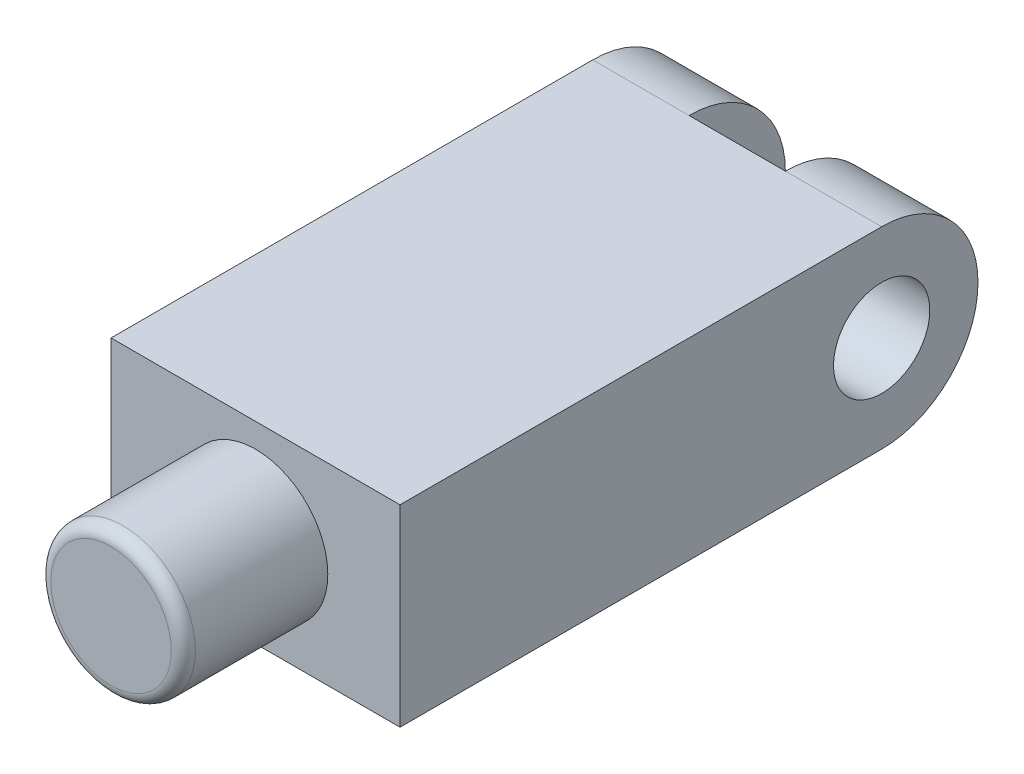
ISO-10303-21;
HEADER;
FILE_DESCRIPTION(('STEP AP214'),'2;1');
FILE_NAME('part.step','',(''),(''),'','','');
FILE_SCHEMA(('AUTOMOTIVE_DESIGN { 1 0 10303 214 1 1 1 1 }'));
ENDSEC;
DATA;
#1=APPLICATION_CONTEXT('core data for automotive mechanical design processes');
#2=APPLICATION_PROTOCOL_DEFINITION('international standard','automotive_design',2000,#1);
#3=PRODUCT_CONTEXT('',#1,'mechanical');
#4=PRODUCT('Part','Part','',(#3));
#5=PRODUCT_RELATED_PRODUCT_CATEGORY('part','',(#4));
#6=PRODUCT_DEFINITION_FORMATION('','',#4);
#7=PRODUCT_DEFINITION_CONTEXT('part definition',#1,'design');
#8=PRODUCT_DEFINITION('design','',#6,#7);
#9=PRODUCT_DEFINITION_SHAPE('','',#8);
#10=(LENGTH_UNIT() NAMED_UNIT(*) SI_UNIT(.MILLI.,.METRE.));
#11=(NAMED_UNIT(*) PLANE_ANGLE_UNIT() SI_UNIT($,.RADIAN.));
#12=(NAMED_UNIT(*) SI_UNIT($,.STERADIAN.) SOLID_ANGLE_UNIT());
#13=UNCERTAINTY_MEASURE_WITH_UNIT(LENGTH_MEASURE(1.E-05),#10,'distance_accuracy_value','');
#14=(GEOMETRIC_REPRESENTATION_CONTEXT(3) GLOBAL_UNCERTAINTY_ASSIGNED_CONTEXT((#13)) GLOBAL_UNIT_ASSIGNED_CONTEXT((#10,
#11,#12)) REPRESENTATION_CONTEXT('',''));
#15=CARTESIAN_POINT('',(0.,0.,0.));
#16=DIRECTION('',(0.,0.,1.));
#17=DIRECTION('',(1.,0.,0.));
#18=AXIS2_PLACEMENT_3D('',#15,#16,#17);
#19=CARTESIAN_POINT('',(50.,5.,0.));
#20=DIRECTION('',(-1.,0.,0.));
#21=DIRECTION('',(0.,0.,1.));
#22=AXIS2_PLACEMENT_3D('',#19,#20,#21);
#23=CYLINDRICAL_SURFACE('',#22,10.);
#24=CARTESIAN_POINT('',(50.,5.,0.));
#25=DIRECTION('',(-1.,0.,0.));
#26=DIRECTION('',(0.,0.,1.));
#27=AXIS2_PLACEMENT_3D('',#24,#25,#26);
#28=CIRCLE('',#27,10.);
#29=CARTESIAN_POINT('',(50.,5.,10.));
#30=VERTEX_POINT('',#29);
#31=EDGE_CURVE('E150',#30,#30,#28,.T.);
#32=ORIENTED_EDGE('',*,*,#31,.F.);
#33=EDGE_LOOP('',(#32));
#34=FACE_BOUND('',#33,.T.);
#35=CARTESIAN_POINT('',(30.,5.,0.));
#36=DIRECTION('',(1.,0.,0.));
#37=DIRECTION('',(0.,0.,-1.));
#38=AXIS2_PLACEMENT_3D('',#35,#36,#37);
#39=CIRCLE('',#38,10.);
#40=CARTESIAN_POINT('',(30.,5.,-10.));
#41=VERTEX_POINT('',#40);
#42=EDGE_CURVE('E158',#41,#41,#39,.T.);
#43=ORIENTED_EDGE('',*,*,#42,.F.);
#44=EDGE_LOOP('',(#43));
#45=FACE_BOUND('',#44,.T.);
#46=ADVANCED_FACE('F39',(#34,#45),#23,.F.);
#47=CARTESIAN_POINT('',(-10.,-15.,100.));
#48=DIRECTION('',(1.,0.,0.));
#49=DIRECTION('',(0.,0.,-1.));
#50=AXIS2_PLACEMENT_3D('',#47,#48,#49);
#51=PLANE('',#50);
#52=CARTESIAN_POINT('',(-10.,5.,0.));
#53=DIRECTION('',(1.,0.,0.));
#54=DIRECTION('',(0.,0.,-1.));
#55=AXIS2_PLACEMENT_3D('',#52,#53,#54);
#56=CIRCLE('',#55,10.);
#57=CARTESIAN_POINT('',(-10.,5.,-10.));
#58=VERTEX_POINT('',#57);
#59=EDGE_CURVE('E162',#58,#58,#56,.T.);
#60=ORIENTED_EDGE('',*,*,#59,.T.);
#61=EDGE_LOOP('',(#60));
#62=FACE_BOUND('',#61,.T.);
#63=DIRECTION('',(0.,0.,-1.));
#64=VECTOR('',#63,1.);
#65=CARTESIAN_POINT('',(-10.,25.,100.));
#66=LINE('',#65,#64);
#67=CARTESIAN_POINT('',(-10.,25.,100.));
#68=VERTEX_POINT('',#67);
#69=CARTESIAN_POINT('',(-10.,25.,0.));
#70=VERTEX_POINT('',#69);
#71=EDGE_CURVE('E111',#68,#70,#66,.T.);
#72=ORIENTED_EDGE('',*,*,#71,.T.);
#73=CARTESIAN_POINT('',(-10.,5.,0.));
#74=DIRECTION('',(-1.,0.,0.));
#75=DIRECTION('',(0.,0.,1.));
#76=AXIS2_PLACEMENT_3D('',#73,#74,#75);
#77=CIRCLE('',#76,20.);
#78=CARTESIAN_POINT('',(-10.,-15.,0.));
#79=VERTEX_POINT('',#78);
#80=EDGE_CURVE('E166',#70,#79,#77,.T.);
#81=ORIENTED_EDGE('',*,*,#80,.T.);
#82=DIRECTION('',(0.,0.,-1.));
#83=VECTOR('',#82,1.);
#84=CARTESIAN_POINT('',(-10.,-15.,100.));
#85=LINE('',#84,#83);
#86=CARTESIAN_POINT('',(-10.,-15.,100.));
#87=VERTEX_POINT('',#86);
#88=EDGE_CURVE('E103',#87,#79,#85,.T.);
#89=ORIENTED_EDGE('',*,*,#88,.F.);
#90=DIRECTION('',(0.,-1.,0.));
#91=VECTOR('',#90,1.);
#92=CARTESIAN_POINT('',(-10.,-15.,100.));
#93=LINE('',#92,#91);
#94=EDGE_CURVE('E91',#68,#87,#93,.T.);
#95=ORIENTED_EDGE('',*,*,#94,.F.);
#96=EDGE_LOOP('',(#72,#81,#89,#95));
#97=FACE_BOUND('',#96,.T.);
#98=ADVANCED_FACE('F207',(#62,#97),#51,.F.);
#99=CARTESIAN_POINT('',(50.,-15.,100.));
#100=DIRECTION('',(0.,1.,0.));
#101=DIRECTION('',(-1.,0.,0.));
#102=AXIS2_PLACEMENT_3D('',#99,#100,#101);
#103=PLANE('',#102);
#104=DIRECTION('',(1.,0.,0.));
#105=VECTOR('',#104,1.);
#106=CARTESIAN_POINT('',(50.,-15.,0.));
#107=LINE('',#106,#105);
#108=CARTESIAN_POINT('',(9.99999999999999,-15.,0.));
#109=VERTEX_POINT('',#108);
#110=EDGE_CURVE('E115',#79,#109,#107,.T.);
#111=ORIENTED_EDGE('',*,*,#110,.T.);
#112=CARTESIAN_POINT('',(30.,-15.,0.));
#113=VERTEX_POINT('',#112);
#114=EDGE_CURVE('E119',#109,#113,#107,.T.);
#115=ORIENTED_EDGE('',*,*,#114,.T.);
#116=CARTESIAN_POINT('',(50.,-15.,0.));
#117=VERTEX_POINT('',#116);
#118=EDGE_CURVE('E101',#113,#117,#107,.T.);
#119=ORIENTED_EDGE('',*,*,#118,.T.);
#120=DIRECTION('',(0.,0.,-1.));
#121=VECTOR('',#120,1.);
#122=CARTESIAN_POINT('',(50.,-15.,100.));
#123=LINE('',#122,#121);
#124=CARTESIAN_POINT('',(50.,-15.,100.));
#125=VERTEX_POINT('',#124);
#126=EDGE_CURVE('E97',#125,#117,#123,.T.);
#127=ORIENTED_EDGE('',*,*,#126,.F.);
#128=DIRECTION('',(1.,0.,0.));
#129=VECTOR('',#128,1.);
#130=CARTESIAN_POINT('',(50.,-15.,100.));
#131=LINE('',#130,#129);
#132=EDGE_CURVE('E85',#87,#125,#131,.T.);
#133=ORIENTED_EDGE('',*,*,#132,.F.);
#134=ORIENTED_EDGE('',*,*,#88,.T.);
#135=EDGE_LOOP('',(#111,#115,#119,#127,#133,#134));
#136=FACE_BOUND('',#135,.T.);
#137=ADVANCED_FACE('F99',(#136),#103,.F.);
#138=CARTESIAN_POINT('',(50.,-15.,100.));
#139=DIRECTION('',(-1.,0.,0.));
#140=DIRECTION('',(0.,0.,1.));
#141=AXIS2_PLACEMENT_3D('',#138,#139,#140);
#142=PLANE('',#141);
#143=ORIENTED_EDGE('',*,*,#31,.T.);
#144=EDGE_LOOP('',(#143));
#145=FACE_BOUND('',#144,.T.);
#146=ORIENTED_EDGE('',*,*,#126,.T.);
#147=CARTESIAN_POINT('',(50.,5.00000000000001,0.));
#148=DIRECTION('',(1.,0.,0.));
#149=DIRECTION('',(0.,0.,-1.));
#150=AXIS2_PLACEMENT_3D('',#147,#148,#149);
#151=CIRCLE('',#150,20.);
#152=CARTESIAN_POINT('',(50.,25.,0.));
#153=VERTEX_POINT('',#152);
#154=EDGE_CURVE('E69',#117,#153,#151,.T.);
#155=ORIENTED_EDGE('',*,*,#154,.T.);
#156=DIRECTION('',(0.,0.,-1.));
#157=VECTOR('',#156,1.);
#158=CARTESIAN_POINT('',(50.,25.,100.));
#159=LINE('',#158,#157);
#160=CARTESIAN_POINT('',(50.,25.,100.));
#161=VERTEX_POINT('',#160);
#162=EDGE_CURVE('E104',#161,#153,#159,.T.);
#163=ORIENTED_EDGE('',*,*,#162,.F.);
#164=DIRECTION('',(0.,1.,0.));
#165=VECTOR('',#164,1.);
#166=CARTESIAN_POINT('',(50.,-15.,100.));
#167=LINE('',#166,#165);
#168=EDGE_CURVE('E89',#125,#161,#167,.T.);
#169=ORIENTED_EDGE('',*,*,#168,.F.);
#170=EDGE_LOOP('',(#146,#155,#163,#169));
#171=FACE_BOUND('',#170,.T.);
#172=ADVANCED_FACE('F106',(#145,#171),#142,.F.);
#173=CARTESIAN_POINT('',(50.,25.,100.));
#174=DIRECTION('',(0.,-1.,0.));
#175=DIRECTION('',(1.,0.,0.));
#176=AXIS2_PLACEMENT_3D('',#173,#174,#175);
#177=PLANE('',#176);
#178=DIRECTION('',(-1.,0.,0.));
#179=VECTOR('',#178,1.);
#180=CARTESIAN_POINT('',(50.,25.,0.));
#181=LINE('',#180,#179);
#182=CARTESIAN_POINT('',(30.,25.,0.));
#183=VERTEX_POINT('',#182);
#184=EDGE_CURVE('E120',#153,#183,#181,.T.);
#185=ORIENTED_EDGE('',*,*,#184,.T.);
#186=CARTESIAN_POINT('',(9.99999999999999,25.,0.));
#187=VERTEX_POINT('',#186);
#188=EDGE_CURVE('E124',#183,#187,#181,.T.);
#189=ORIENTED_EDGE('',*,*,#188,.T.);
#190=EDGE_CURVE('E118',#187,#70,#181,.T.);
#191=ORIENTED_EDGE('',*,*,#190,.T.);
#192=ORIENTED_EDGE('',*,*,#71,.F.);
#193=DIRECTION('',(-1.,0.,0.));
#194=VECTOR('',#193,1.);
#195=CARTESIAN_POINT('',(50.,25.,100.));
#196=LINE('',#195,#194);
#197=EDGE_CURVE('E57',#161,#68,#196,.T.);
#198=ORIENTED_EDGE('',*,*,#197,.F.);
#199=ORIENTED_EDGE('',*,*,#162,.T.);
#200=EDGE_LOOP('',(#185,#189,#191,#192,#198,#199));
#201=FACE_BOUND('',#200,.T.);
#202=ADVANCED_FACE('F204',(#201),#177,.F.);
#203=CARTESIAN_POINT('',(0.,0.,100.));
#204=DIRECTION('',(0.,0.,1.));
#205=DIRECTION('',(1.,0.,0.));
#206=AXIS2_PLACEMENT_3D('',#203,#204,#205);
#207=PLANE('',#206);
#208=CARTESIAN_POINT('',(20.,5.,100.));
#209=DIRECTION('',(0.,0.,1.));
#210=DIRECTION('',(1.,0.,0.));
#211=AXIS2_PLACEMENT_3D('',#208,#209,#210);
#212=CIRCLE('',#211,15.);
#213=CARTESIAN_POINT('',(35.,5.,100.));
#214=VERTEX_POINT('',#213);
#215=EDGE_CURVE('E135',#214,#214,#212,.T.);
#216=ORIENTED_EDGE('',*,*,#215,.F.);
#217=EDGE_LOOP('',(#216));
#218=FACE_BOUND('',#217,.T.);
#219=ORIENTED_EDGE('',*,*,#94,.T.);
#220=ORIENTED_EDGE('',*,*,#132,.T.);
#221=ORIENTED_EDGE('',*,*,#168,.T.);
#222=ORIENTED_EDGE('',*,*,#197,.T.);
#223=EDGE_LOOP('',(#219,#220,#221,#222));
#224=FACE_BOUND('',#223,.T.);
#225=ADVANCED_FACE('F87',(#218,#224),#207,.T.);
#226=CARTESIAN_POINT('',(30.,5.00000000000001,0.));
#227=DIRECTION('',(1.,0.,0.));
#228=DIRECTION('',(0.,0.,-1.));
#229=AXIS2_PLACEMENT_3D('',#226,#227,#228);
#230=CYLINDRICAL_SURFACE('',#229,20.);
#231=ORIENTED_EDGE('',*,*,#118,.F.);
#232=CARTESIAN_POINT('',(30.,5.00000000000001,0.));
#233=DIRECTION('',(1.,0.,0.));
#234=DIRECTION('',(0.,0.,-1.));
#235=AXIS2_PLACEMENT_3D('',#232,#233,#234);
#236=CIRCLE('',#235,20.);
#237=EDGE_CURVE('E174',#113,#183,#236,.T.);
#238=ORIENTED_EDGE('',*,*,#237,.T.);
#239=ORIENTED_EDGE('',*,*,#184,.F.);
#240=ORIENTED_EDGE('',*,*,#154,.F.);
#241=EDGE_LOOP('',(#231,#238,#239,#240));
#242=FACE_BOUND('',#241,.T.);
#243=ADVANCED_FACE('F195',(#242),#230,.T.);
#244=CARTESIAN_POINT('',(30.,5.00000000000001,0.));
#245=DIRECTION('',(1.,0.,0.));
#246=DIRECTION('',(0.,0.,-1.));
#247=AXIS2_PLACEMENT_3D('',#244,#245,#246);
#248=PLANE('',#247);
#249=CARTESIAN_POINT('',(30.,5.,0.));
#250=DIRECTION('',(-1.,0.,0.));
#251=DIRECTION('',(0.,0.,1.));
#252=AXIS2_PLACEMENT_3D('',#249,#250,#251);
#253=CIRCLE('',#252,20.);
#254=EDGE_CURVE('E151',#113,#183,#253,.T.);
#255=ORIENTED_EDGE('',*,*,#254,.T.);
#256=ORIENTED_EDGE('',*,*,#237,.F.);
#257=EDGE_LOOP('',(#255,#256));
#258=FACE_BOUND('',#257,.T.);
#259=ORIENTED_EDGE('',*,*,#42,.T.);
#260=EDGE_LOOP('',(#259));
#261=FACE_BOUND('',#260,.T.);
#262=ADVANCED_FACE('F197',(#258,#261),#248,.F.);
#263=CARTESIAN_POINT('',(10.,5.,0.));
#264=DIRECTION('',(-1.,0.,0.));
#265=DIRECTION('',(0.,0.,1.));
#266=AXIS2_PLACEMENT_3D('',#263,#264,#265);
#267=PLANE('',#266);
#268=CARTESIAN_POINT('',(10.,5.,0.));
#269=DIRECTION('',(-1.,0.,0.));
#270=DIRECTION('',(0.,0.,1.));
#271=AXIS2_PLACEMENT_3D('',#268,#269,#270);
#272=CIRCLE('',#271,10.);
#273=CARTESIAN_POINT('',(10.,5.,10.));
#274=VERTEX_POINT('',#273);
#275=EDGE_CURVE('E132',#274,#274,#272,.T.);
#276=ORIENTED_EDGE('',*,*,#275,.T.);
#277=EDGE_LOOP('',(#276));
#278=FACE_BOUND('',#277,.T.);
#279=CARTESIAN_POINT('',(10.,5.,0.));
#280=DIRECTION('',(-1.,0.,0.));
#281=DIRECTION('',(0.,0.,1.));
#282=AXIS2_PLACEMENT_3D('',#279,#280,#281);
#283=CIRCLE('',#282,20.);
#284=EDGE_CURVE('E167',#187,#109,#283,.T.);
#285=ORIENTED_EDGE('',*,*,#284,.F.);
#286=CARTESIAN_POINT('',(9.99999999999999,5.,0.));
#287=DIRECTION('',(-1.,0.,0.));
#288=DIRECTION('',(0.,0.,1.));
#289=AXIS2_PLACEMENT_3D('',#286,#287,#288);
#290=CIRCLE('',#289,20.);
#291=EDGE_CURVE('E146',#109,#187,#290,.T.);
#292=ORIENTED_EDGE('',*,*,#291,.F.);
#293=EDGE_LOOP('',(#285,#292));
#294=FACE_BOUND('',#293,.T.);
#295=ADVANCED_FACE('F212',(#278,#294),#267,.F.);
#296=CARTESIAN_POINT('',(10.,5.,0.));
#297=DIRECTION('',(-1.,0.,0.));
#298=DIRECTION('',(0.,0.,1.));
#299=AXIS2_PLACEMENT_3D('',#296,#297,#298);
#300=CYLINDRICAL_SURFACE('',#299,20.);
#301=ORIENTED_EDGE('',*,*,#284,.T.);
#302=ORIENTED_EDGE('',*,*,#110,.F.);
#303=ORIENTED_EDGE('',*,*,#80,.F.);
#304=ORIENTED_EDGE('',*,*,#190,.F.);
#305=EDGE_LOOP('',(#301,#302,#303,#304));
#306=FACE_BOUND('',#305,.T.);
#307=ADVANCED_FACE('F209',(#306),#300,.T.);
#308=ORIENTED_EDGE('',*,*,#275,.F.);
#309=EDGE_LOOP('',(#308));
#310=FACE_BOUND('',#309,.T.);
#311=ORIENTED_EDGE('',*,*,#59,.F.);
#312=EDGE_LOOP('',(#311));
#313=FACE_BOUND('',#312,.T.);
#314=ADVANCED_FACE('F220',(#310,#313),#23,.F.);
#315=CARTESIAN_POINT('',(9.99999999999999,5.,0.));
#316=DIRECTION('',(1.,0.,0.));
#317=DIRECTION('',(0.,0.,-1.));
#318=AXIS2_PLACEMENT_3D('',#315,#316,#317);
#319=CYLINDRICAL_SURFACE('',#318,20.);
#320=ORIENTED_EDGE('',*,*,#114,.F.);
#321=ORIENTED_EDGE('',*,*,#291,.T.);
#322=ORIENTED_EDGE('',*,*,#188,.F.);
#323=ORIENTED_EDGE('',*,*,#254,.F.);
#324=EDGE_LOOP('',(#320,#321,#322,#323));
#325=FACE_BOUND('',#324,.T.);
#326=ADVANCED_FACE('F201',(#325),#319,.F.);
#327=CARTESIAN_POINT('',(20.,5.,130.));
#328=DIRECTION('',(0.,0.,-1.));
#329=DIRECTION('',(-1.,0.,0.));
#330=AXIS2_PLACEMENT_3D('',#327,#328,#329);
#331=CYLINDRICAL_SURFACE('',#330,15.);
#332=CARTESIAN_POINT('',(20.,5.,127.5));
#333=DIRECTION('',(0.,0.,1.));
#334=DIRECTION('',(1.,0.,0.));
#335=AXIS2_PLACEMENT_3D('',#332,#333,#334);
#336=CIRCLE('',#335,15.);
#337=CARTESIAN_POINT('',(35.,5.,127.5));
#338=VERTEX_POINT('',#337);
#339=EDGE_CURVE('E11',#338,#338,#336,.F.);
#340=ORIENTED_EDGE('',*,*,#339,.T.);
#341=EDGE_LOOP('',(#340));
#342=FACE_BOUND('',#341,.T.);
#343=ORIENTED_EDGE('',*,*,#215,.T.);
#344=EDGE_LOOP('',(#343));
#345=FACE_BOUND('',#344,.T.);
#346=ADVANCED_FACE('F238',(#342,#345),#331,.T.);
#347=CARTESIAN_POINT('',(20.,5.,130.));
#348=DIRECTION('',(0.,0.,1.));
#349=DIRECTION('',(1.,0.,0.));
#350=AXIS2_PLACEMENT_3D('',#347,#348,#349);
#351=PLANE('',#350);
#352=CARTESIAN_POINT('',(20.,5.,130.));
#353=DIRECTION('',(0.,0.,1.));
#354=DIRECTION('',(1.,0.,0.));
#355=AXIS2_PLACEMENT_3D('',#352,#353,#354);
#356=CIRCLE('',#355,12.5);
#357=CARTESIAN_POINT('',(32.5,5.,130.));
#358=VERTEX_POINT('',#357);
#359=EDGE_CURVE('E49',#358,#358,#356,.T.);
#360=ORIENTED_EDGE('',*,*,#359,.T.);
#361=EDGE_LOOP('',(#360));
#362=FACE_BOUND('',#361,.T.);
#363=ADVANCED_FACE('F245',(#362),#351,.T.);
#364=CARTESIAN_POINT('',(20.,5.,127.5));
#365=DIRECTION('',(0.,0.,1.));
#366=DIRECTION('',(1.,0.,0.));
#367=AXIS2_PLACEMENT_3D('',#364,#365,#366);
#368=TOROIDAL_SURFACE('',#367,12.5,2.5);
#369=ORIENTED_EDGE('',*,*,#339,.F.);
#370=EDGE_LOOP('',(#369));
#371=FACE_BOUND('',#370,.T.);
#372=ORIENTED_EDGE('',*,*,#359,.F.);
#373=EDGE_LOOP('',(#372));
#374=FACE_BOUND('',#373,.T.);
#375=ADVANCED_FACE('F41',(#371,#374),#368,.T.);
#376=CLOSED_SHELL('',(#46,#98,#137,#172,#202,#225,#243,#262,#295,#307,#314,#326,#346,#363,#375));
#377=MANIFOLD_SOLID_BREP('B2',#376);
#378=ADVANCED_BREP_SHAPE_REPRESENTATION('',(#18,#377),#14);
#379=SHAPE_DEFINITION_REPRESENTATION(#9,#378);
ENDSEC;
END-ISO-10303-21;
